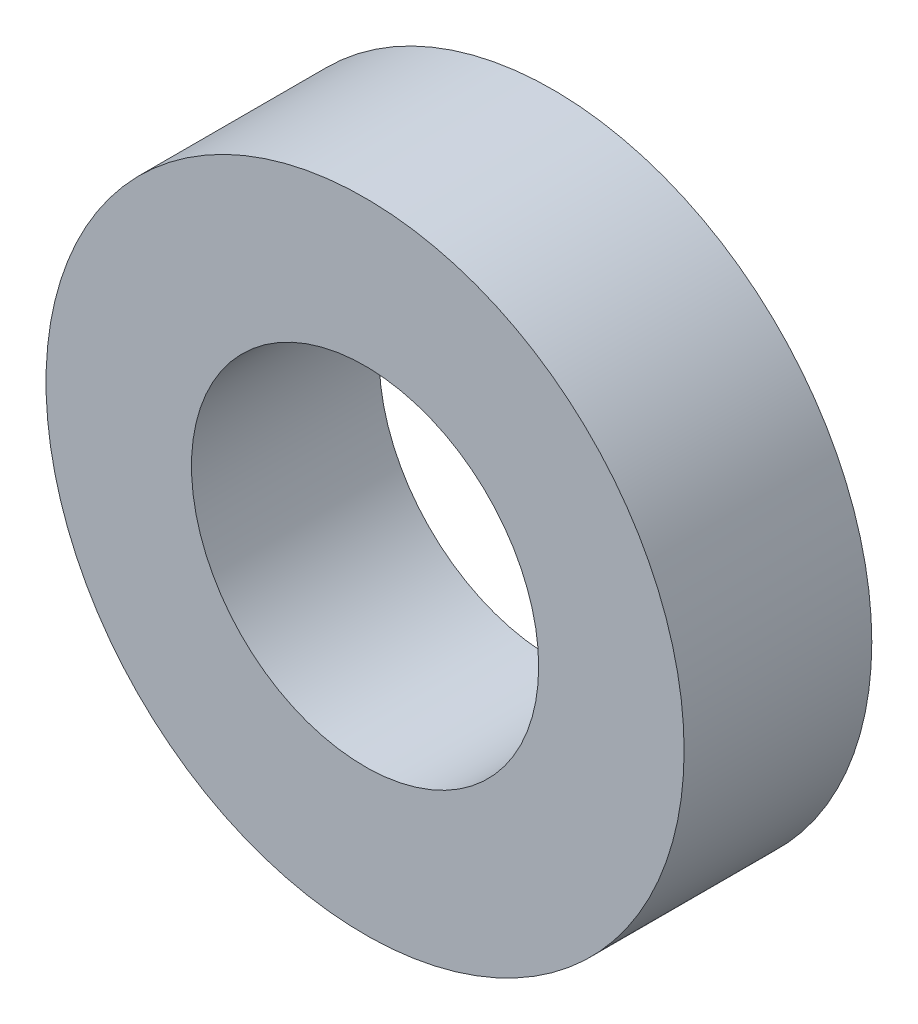
ISO-10303-21;
HEADER;
FILE_DESCRIPTION(('STEP AP214'),'2;1');
FILE_NAME('part.step','',(''),(''),'','','');
FILE_SCHEMA(('AUTOMOTIVE_DESIGN { 1 0 10303 214 1 1 1 1 }'));
ENDSEC;
DATA;
#1=APPLICATION_CONTEXT('core data for automotive mechanical design processes');
#2=APPLICATION_PROTOCOL_DEFINITION('international standard','automotive_design',2000,#1);
#3=PRODUCT_CONTEXT('',#1,'mechanical');
#4=PRODUCT('Part','Part','',(#3));
#5=PRODUCT_RELATED_PRODUCT_CATEGORY('part','',(#4));
#6=PRODUCT_DEFINITION_FORMATION('','',#4);
#7=PRODUCT_DEFINITION_CONTEXT('part definition',#1,'design');
#8=PRODUCT_DEFINITION('design','',#6,#7);
#9=PRODUCT_DEFINITION_SHAPE('','',#8);
#10=(LENGTH_UNIT() NAMED_UNIT(*) SI_UNIT(.MILLI.,.METRE.));
#11=(NAMED_UNIT(*) PLANE_ANGLE_UNIT() SI_UNIT($,.RADIAN.));
#12=(NAMED_UNIT(*) SI_UNIT($,.STERADIAN.) SOLID_ANGLE_UNIT());
#13=UNCERTAINTY_MEASURE_WITH_UNIT(LENGTH_MEASURE(1.E-05),#10,'distance_accuracy_value','');
#14=(GEOMETRIC_REPRESENTATION_CONTEXT(3) GLOBAL_UNCERTAINTY_ASSIGNED_CONTEXT((#13)) GLOBAL_UNIT_ASSIGNED_CONTEXT((#10,
#11,#12)) REPRESENTATION_CONTEXT('',''));
#15=CARTESIAN_POINT('',(0.,0.,0.));
#16=DIRECTION('',(0.,0.,1.));
#17=DIRECTION('',(1.,0.,0.));
#18=AXIS2_PLACEMENT_3D('',#15,#16,#17);
#19=CARTESIAN_POINT('',(0.,0.,2.));
#20=DIRECTION('',(0.,0.,1.));
#21=DIRECTION('',(1.,0.,0.));
#22=AXIS2_PLACEMENT_3D('',#19,#20,#21);
#23=PLANE('',#22);
#24=CARTESIAN_POINT('',(0.,0.,2.));
#25=DIRECTION('',(0.,0.,1.));
#26=DIRECTION('',(1.,0.,0.));
#27=AXIS2_PLACEMENT_3D('',#24,#25,#26);
#28=CIRCLE('',#27,6.8);
#29=CARTESIAN_POINT('',(6.8,0.,2.));
#30=VERTEX_POINT('',#29);
#31=EDGE_CURVE('E10',#30,#30,#28,.T.);
#32=ORIENTED_EDGE('',*,*,#31,.T.);
#33=EDGE_LOOP('',(#32));
#34=FACE_BOUND('',#33,.T.);
#35=CARTESIAN_POINT('',(0.,0.,2.));
#36=DIRECTION('',(0.,0.,1.));
#37=DIRECTION('',(1.,0.,0.));
#38=AXIS2_PLACEMENT_3D('',#35,#36,#37);
#39=CIRCLE('',#38,3.7);
#40=CARTESIAN_POINT('',(3.7,0.,2.));
#41=VERTEX_POINT('',#40);
#42=EDGE_CURVE('E50',#41,#41,#39,.T.);
#43=ORIENTED_EDGE('',*,*,#42,.F.);
#44=EDGE_LOOP('',(#43));
#45=FACE_BOUND('',#44,.T.);
#46=ADVANCED_FACE('F37',(#34,#45),#23,.T.);
#47=CARTESIAN_POINT('',(0.,0.,-2.));
#48=DIRECTION('',(0.,0.,1.));
#49=DIRECTION('',(1.,0.,0.));
#50=AXIS2_PLACEMENT_3D('',#47,#48,#49);
#51=PLANE('',#50);
#52=CARTESIAN_POINT('',(0.,0.,-2.));
#53=DIRECTION('',(0.,0.,1.));
#54=DIRECTION('',(1.,0.,0.));
#55=AXIS2_PLACEMENT_3D('',#52,#53,#54);
#56=CIRCLE('',#55,6.8);
#57=CARTESIAN_POINT('',(6.8,0.,-2.));
#58=VERTEX_POINT('',#57);
#59=EDGE_CURVE('E41',#58,#58,#56,.T.);
#60=ORIENTED_EDGE('',*,*,#59,.F.);
#61=EDGE_LOOP('',(#60));
#62=FACE_BOUND('',#61,.T.);
#63=CARTESIAN_POINT('',(0.,0.,-2.));
#64=DIRECTION('',(0.,0.,1.));
#65=DIRECTION('',(1.,0.,0.));
#66=AXIS2_PLACEMENT_3D('',#63,#64,#65);
#67=CIRCLE('',#66,3.7);
#68=CARTESIAN_POINT('',(3.7,0.,-2.));
#69=VERTEX_POINT('',#68);
#70=EDGE_CURVE('E52',#69,#69,#67,.T.);
#71=ORIENTED_EDGE('',*,*,#70,.T.);
#72=EDGE_LOOP('',(#71));
#73=FACE_BOUND('',#72,.T.);
#74=ADVANCED_FACE('F64',(#62,#73),#51,.F.);
#75=CARTESIAN_POINT('',(0.,0.,2.));
#76=DIRECTION('',(0.,0.,-1.));
#77=DIRECTION('',(-1.,0.,0.));
#78=AXIS2_PLACEMENT_3D('',#75,#76,#77);
#79=CYLINDRICAL_SURFACE('',#78,6.8);
#80=ORIENTED_EDGE('',*,*,#31,.F.);
#81=EDGE_LOOP('',(#80));
#82=FACE_BOUND('',#81,.T.);
#83=ORIENTED_EDGE('',*,*,#59,.T.);
#84=EDGE_LOOP('',(#83));
#85=FACE_BOUND('',#84,.T.);
#86=ADVANCED_FACE('F39',(#82,#85),#79,.T.);
#87=CARTESIAN_POINT('',(0.,0.,2.));
#88=DIRECTION('',(0.,0.,-1.));
#89=DIRECTION('',(-1.,0.,0.));
#90=AXIS2_PLACEMENT_3D('',#87,#88,#89);
#91=CYLINDRICAL_SURFACE('',#90,3.7);
#92=ORIENTED_EDGE('',*,*,#42,.T.);
#93=EDGE_LOOP('',(#92));
#94=FACE_BOUND('',#93,.T.);
#95=ORIENTED_EDGE('',*,*,#70,.F.);
#96=EDGE_LOOP('',(#95));
#97=FACE_BOUND('',#96,.T.);
#98=ADVANCED_FACE('F60',(#94,#97),#91,.F.);
#99=CLOSED_SHELL('',(#46,#74,#86,#98));
#100=MANIFOLD_SOLID_BREP('B2',#99);
#101=ADVANCED_BREP_SHAPE_REPRESENTATION('',(#18,#100),#14);
#102=SHAPE_DEFINITION_REPRESENTATION(#9,#101);
ENDSEC;
END-ISO-10303-21;
